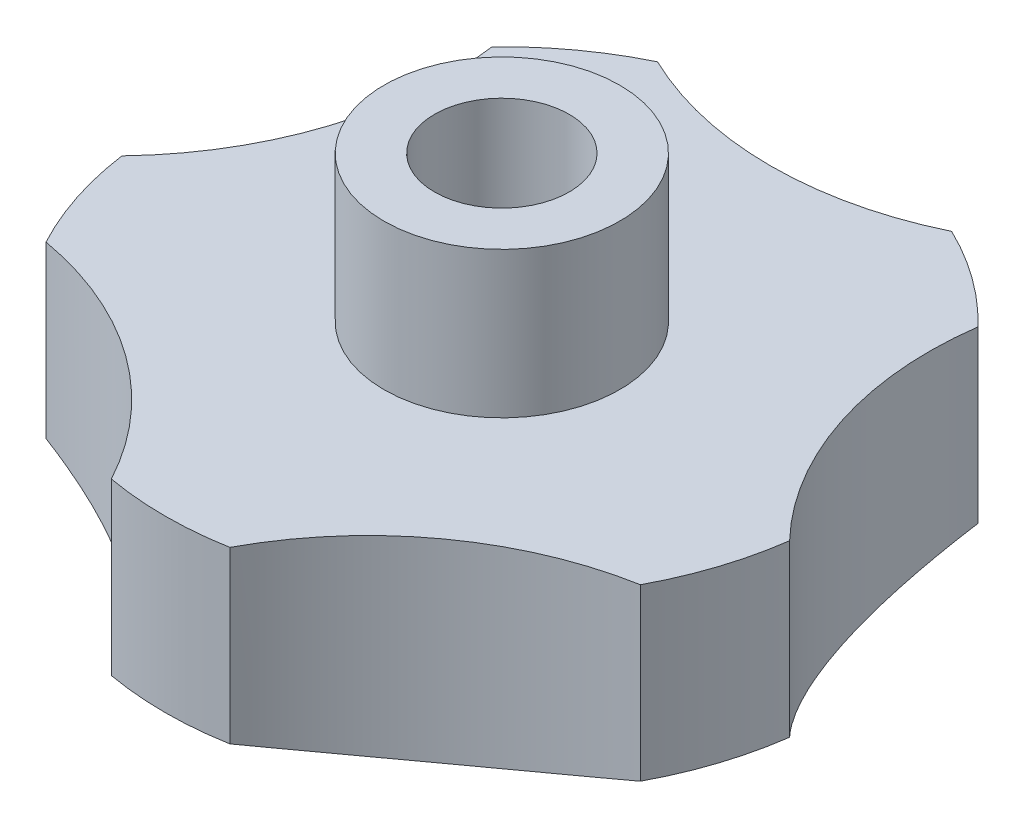
ISO-10303-21;
HEADER;
FILE_DESCRIPTION(('STEP AP214'),'2;1');
FILE_NAME('part.step','',(''),(''),'','','');
FILE_SCHEMA(('AUTOMOTIVE_DESIGN { 1 0 10303 214 1 1 1 1 }'));
ENDSEC;
DATA;
#1=APPLICATION_CONTEXT('core data for automotive mechanical design processes');
#2=APPLICATION_PROTOCOL_DEFINITION('international standard','automotive_design',2000,#1);
#3=PRODUCT_CONTEXT('',#1,'mechanical');
#4=PRODUCT('Part','Part','',(#3));
#5=PRODUCT_RELATED_PRODUCT_CATEGORY('part','',(#4));
#6=PRODUCT_DEFINITION_FORMATION('','',#4);
#7=PRODUCT_DEFINITION_CONTEXT('part definition',#1,'design');
#8=PRODUCT_DEFINITION('design','',#6,#7);
#9=PRODUCT_DEFINITION_SHAPE('','',#8);
#10=(LENGTH_UNIT() NAMED_UNIT(*) SI_UNIT(.MILLI.,.METRE.));
#11=(NAMED_UNIT(*) PLANE_ANGLE_UNIT() SI_UNIT($,.RADIAN.));
#12=(NAMED_UNIT(*) SI_UNIT($,.STERADIAN.) SOLID_ANGLE_UNIT());
#13=UNCERTAINTY_MEASURE_WITH_UNIT(LENGTH_MEASURE(1.E-05),#10,'distance_accuracy_value','');
#14=(GEOMETRIC_REPRESENTATION_CONTEXT(3) GLOBAL_UNCERTAINTY_ASSIGNED_CONTEXT((#13)) GLOBAL_UNIT_ASSIGNED_CONTEXT((#10,
#11,#12)) REPRESENTATION_CONTEXT('',''));
#15=CARTESIAN_POINT('',(0.,0.,0.));
#16=DIRECTION('',(0.,0.,1.));
#17=DIRECTION('',(1.,0.,0.));
#18=AXIS2_PLACEMENT_3D('',#15,#16,#17);
#19=CARTESIAN_POINT('',(55.5,-13.,15.));
#20=DIRECTION('',(0.,-1.,0.));
#21=DIRECTION('',(0.,0.,-1.));
#22=AXIS2_PLACEMENT_3D('',#19,#20,#21);
#23=CYLINDRICAL_SURFACE('',#22,30.);
#24=CARTESIAN_POINT('',(55.5,-28.16198487095,15.));
#25=DIRECTION('',(0.,-1.,0.));
#26=DIRECTION('',(0.,0.,-1.));
#27=AXIS2_PLACEMENT_3D('',#24,#25,#26);
#28=CIRCLE('',#27,30.);
#29=CARTESIAN_POINT('',(85.2204509421926,-28.16198487095,19.0859265525364));
#30=VERTEX_POINT('',#29);
#31=CARTESIAN_POINT('',(81.9671536916719,-28.1619848709578,29.1240849424393));
#32=VERTEX_POINT('',#31);
#33=EDGE_CURVE('E134',#30,#32,#28,.T.);
#34=ORIENTED_EDGE('',*,*,#33,.F.);
#35=DIRECTION('',(0.,1.,0.));
#36=VECTOR('',#35,1.);
#37=CARTESIAN_POINT('',(85.2204509421919,-34.001,19.085926552534));
#38=LINE('',#37,#36);
#39=CARTESIAN_POINT('',(85.2204509421919,-13.,19.085926552534));
#40=VERTEX_POINT('',#39);
#41=EDGE_CURVE('E120',#30,#40,#38,.T.);
#42=ORIENTED_EDGE('',*,*,#41,.T.);
#43=CARTESIAN_POINT('',(55.5,-13.,15.));
#44=DIRECTION('',(0.,1.,0.));
#45=DIRECTION('',(0.,0.,1.));
#46=AXIS2_PLACEMENT_3D('',#43,#44,#45);
#47=CIRCLE('',#46,30.);
#48=CARTESIAN_POINT('',(81.9671536916745,-13.,29.1240849424407));
#49=VERTEX_POINT('',#48);
#50=EDGE_CURVE('E171',#49,#40,#47,.T.);
#51=ORIENTED_EDGE('',*,*,#50,.F.);
#52=DIRECTION('',(0.,1.,0.));
#53=VECTOR('',#52,1.);
#54=CARTESIAN_POINT('',(81.9671536916719,-34.001,29.1240849424393));
#55=LINE('',#54,#53);
#56=EDGE_CURVE('E68',#32,#49,#55,.T.);
#57=ORIENTED_EDGE('',*,*,#56,.F.);
#58=EDGE_LOOP('',(#34,#42,#51,#57));
#59=FACE_BOUND('',#58,.T.);
#60=ADVANCED_FACE('F43',(#59),#23,.T.);
#61=CARTESIAN_POINT('',(55.5,-28.16198487095,15.));
#62=DIRECTION('',(0.,-1.,0.));
#63=DIRECTION('',(0.,0.,-1.));
#64=AXIS2_PLACEMENT_3D('',#61,#62,#63);
#65=CIRCLE('',#64,30.);
#66=CARTESIAN_POINT('',(60.7981773487384,-28.16198487095,44.528449278303));
#67=VERTEX_POINT('',#66);
#68=CARTESIAN_POINT('',(50.245997262254,-28.1619848709566,44.5363412634632));
#69=VERTEX_POINT('',#68);
#70=EDGE_CURVE('E53',#67,#69,#65,.T.);
#71=ORIENTED_EDGE('',*,*,#70,.F.);
#72=DIRECTION('',(0.,1.,0.));
#73=VECTOR('',#72,1.);
#74=CARTESIAN_POINT('',(60.7981773487367,-34.001,44.5284492783033));
#75=LINE('',#74,#73);
#76=CARTESIAN_POINT('',(60.7981773487367,-13.,44.5284492783033));
#77=VERTEX_POINT('',#76);
#78=EDGE_CURVE('E253',#67,#77,#75,.T.);
#79=ORIENTED_EDGE('',*,*,#78,.T.);
#80=CARTESIAN_POINT('',(50.245997262254,-13.,44.5363412634632));
#81=VERTEX_POINT('',#80);
#82=EDGE_CURVE('E169',#81,#77,#47,.T.);
#83=ORIENTED_EDGE('',*,*,#82,.F.);
#84=DIRECTION('',(0.,1.,0.));
#85=VECTOR('',#84,1.);
#86=CARTESIAN_POINT('',(50.245997262254,-34.001,44.5363412634632));
#87=LINE('',#86,#85);
#88=EDGE_CURVE('E214',#69,#81,#87,.T.);
#89=ORIENTED_EDGE('',*,*,#88,.F.);
#90=EDGE_LOOP('',(#71,#79,#83,#89));
#91=FACE_BOUND('',#90,.T.);
#92=ADVANCED_FACE('F276',(#91),#23,.T.);
#93=CARTESIAN_POINT('',(55.5,-28.16198487095,15.));
#94=DIRECTION('',(0.,-1.,0.));
#95=DIRECTION('',(0.,0.,-1.));
#96=AXIS2_PLACEMENT_3D('',#93,#94,#95);
#97=CIRCLE('',#96,30.);
#98=CARTESIAN_POINT('',(29.0540027377509,-28.16198487095,29.1636587365381));
#99=VERTEX_POINT('',#98);
#100=CARTESIAN_POINT('',(25.785694039408,-28.161984870956,19.1303778617005));
#101=VERTEX_POINT('',#100);
#102=EDGE_CURVE('E152',#99,#101,#97,.T.);
#103=ORIENTED_EDGE('',*,*,#102,.F.);
#104=DIRECTION('',(0.,1.,0.));
#105=VECTOR('',#104,1.);
#106=CARTESIAN_POINT('',(29.0540027377508,-34.001,29.1636587365379));
#107=LINE('',#106,#105);
#108=CARTESIAN_POINT('',(29.0540027377508,-13.,29.1636587365378));
#109=VERTEX_POINT('',#108);
#110=EDGE_CURVE('E262',#99,#109,#107,.T.);
#111=ORIENTED_EDGE('',*,*,#110,.T.);
#112=CARTESIAN_POINT('',(25.7856940394096,-13.,19.1303778617002));
#113=VERTEX_POINT('',#112);
#114=EDGE_CURVE('E161',#113,#109,#47,.T.);
#115=ORIENTED_EDGE('',*,*,#114,.F.);
#116=DIRECTION('',(0.,1.,0.));
#117=VECTOR('',#116,1.);
#118=CARTESIAN_POINT('',(25.785694039408,-34.001,19.1303778617005));
#119=LINE('',#118,#117);
#120=EDGE_CURVE('E190',#101,#113,#119,.T.);
#121=ORIENTED_EDGE('',*,*,#120,.F.);
#122=EDGE_LOOP('',(#103,#111,#115,#121));
#123=FACE_BOUND('',#122,.T.);
#124=ADVANCED_FACE('F266',(#123),#23,.T.);
#125=CARTESIAN_POINT('',(55.5,-28.16198487095,15.));
#126=DIRECTION('',(0.,-1.,0.));
#127=DIRECTION('',(0.,0.,-1.));
#128=AXIS2_PLACEMENT_3D('',#125,#126,#127);
#129=CIRCLE('',#128,30.);
#130=CARTESIAN_POINT('',(33.8572974768068,-28.16198487095,-5.77482677406887));
#131=VERTEX_POINT('',#130);
#132=CARTESIAN_POINT('',(42.3895517019842,-28.1619848709564,-11.98362735855));
#133=VERTEX_POINT('',#132);
#134=EDGE_CURVE('E147',#131,#133,#129,.T.);
#135=ORIENTED_EDGE('',*,*,#134,.F.);
#136=DIRECTION('',(0.,1.,0.));
#137=VECTOR('',#136,1.);
#138=CARTESIAN_POINT('',(33.8572974768057,-34.001,-5.77482677406999));
#139=LINE('',#138,#137);
#140=CARTESIAN_POINT('',(33.8572974768057,-13.,-5.77482677407));
#141=VERTEX_POINT('',#140);
#142=EDGE_CURVE('E218',#131,#141,#139,.T.);
#143=ORIENTED_EDGE('',*,*,#142,.T.);
#144=CARTESIAN_POINT('',(42.3895517019845,-13.,-11.9836273585495));
#145=VERTEX_POINT('',#144);
#146=EDGE_CURVE('E155',#145,#141,#47,.T.);
#147=ORIENTED_EDGE('',*,*,#146,.F.);
#148=DIRECTION('',(0.,1.,0.));
#149=VECTOR('',#148,1.);
#150=CARTESIAN_POINT('',(42.3895517019842,-34.001,-11.98362735855));
#151=LINE('',#150,#149);
#152=EDGE_CURVE('E172',#133,#145,#151,.T.);
#153=ORIENTED_EDGE('',*,*,#152,.F.);
#154=EDGE_LOOP('',(#135,#143,#147,#153));
#155=FACE_BOUND('',#154,.T.);
#156=ADVANCED_FACE('F222',(#155),#23,.T.);
#157=CARTESIAN_POINT('',(55.5,46.,15.));
#158=DIRECTION('',(1.,0.,0.));
#159=DIRECTION('',(0.,0.,1.));
#160=AXIS2_PLACEMENT_3D('',#157,#158,#159);
#161=SPHERICAL_SURFACE('',#160,80.);
#162=CARTESIAN_POINT('',(77.1116033046685,-28.1619848709569,-5.80717670904926));
#163=CARTESIAN_POINT('',(77.0499413857583,-28.3057619705109,-5.35878222840066));
#164=CARTESIAN_POINT('',(76.9981760830371,-28.4430570324421,-4.9069188916968));
#165=CARTESIAN_POINT('',(76.9150332863663,-28.7042542614438,-3.99727105366044));
#166=CARTESIAN_POINT('',(76.8836646979863,-28.8281505587187,-3.53948405480027));
#167=CARTESIAN_POINT('',(76.8419624041372,-29.0620084964046,-2.61934622458069));
#168=CARTESIAN_POINT('',(76.831631105385,-29.1719685411254,-2.15699487712792));
#169=CARTESIAN_POINT('',(76.8325042014414,-29.3775632483352,-1.22878108499693));
#170=CARTESIAN_POINT('',(76.8437241382562,-29.4731875187439,-0.762916347926156));
#171=CARTESIAN_POINT('',(76.8881148302794,-29.6495936119504,0.170515956728901));
#172=CARTESIAN_POINT('',(76.9212825978724,-29.7303774529673,0.638083283936881));
#173=CARTESIAN_POINT('',(77.0098232056805,-29.8767553460426,1.57347597268542));
#174=CARTESIAN_POINT('',(77.0651949786497,-29.9423501279312,2.04130132074498));
#175=CARTESIAN_POINT('',(77.1984432013172,-30.0582067279662,2.97693876286542));
#176=CARTESIAN_POINT('',(77.2763791325939,-30.1084272885915,3.4447475102946));
#177=CARTESIAN_POINT('',(77.4546798741421,-30.1930632047837,4.37755036241337));
#178=CARTESIAN_POINT('',(77.5550462869992,-30.2274774305019,4.84254426355198));
#179=CARTESIAN_POINT('',(77.7780300423941,-30.2803288316112,5.76809338772924));
#180=CARTESIAN_POINT('',(77.9006476822345,-30.2987657935081,6.22864855137452));
#181=CARTESIAN_POINT('',(78.1676954217505,-30.3195635454146,7.14336300180393));
#182=CARTESIAN_POINT('',(78.3121082246157,-30.3219370156651,7.59752705092104));
#183=CARTESIAN_POINT('',(78.6223384239734,-30.3106284422647,8.49828031449949));
#184=CARTESIAN_POINT('',(78.7881554697206,-30.2969466616771,8.94486965294989));
#185=CARTESIAN_POINT('',(79.1405399302335,-30.2536018263319,9.82892421771793));
#186=CARTESIAN_POINT('',(79.3271057917216,-30.223939967221,10.2663901241174));
#187=CARTESIAN_POINT('',(79.8090329663669,-30.1317967571654,11.3260104964225));
#188=CARTESIAN_POINT('',(80.11549477669,-30.0605451789217,11.9424129996385));
#189=CARTESIAN_POINT('',(80.7678605210495,-29.8853596491317,13.1491381364175));
#190=CARTESIAN_POINT('',(81.1137682442232,-29.7814225561572,13.7394582569618));
#191=CARTESIAN_POINT('',(81.8415895671283,-29.5419494862349,14.8901882926945));
#192=CARTESIAN_POINT('',(82.2234805205519,-29.4064333057336,15.4506166771836));
#193=CARTESIAN_POINT('',(83.0198397033724,-29.1050415603034,16.5388920339245));
#194=CARTESIAN_POINT('',(83.4342939285772,-28.9391790058296,17.0667528397363));
#195=CARTESIAN_POINT('',(84.0823744339332,-28.6667111960529,17.8381035041633));
#196=CARTESIAN_POINT('',(84.305353792303,-28.5707752433248,18.0944621524721));
#197=CARTESIAN_POINT('',(84.7579490086552,-28.3717360454929,18.5974134738965));
#198=CARTESIAN_POINT('',(84.9875511651928,-28.2686470533675,18.8440241134742));
#199=CARTESIAN_POINT('',(85.2204509421914,-28.1619848709572,19.0859265525344));
#200=B_SPLINE_CURVE_WITH_KNOTS('',3,(#162,#163,#164,#165,#166,#167,#168,#169,#170,#171,#172,
#173,#174,#175,#176,#177,#178,#179,#180,#181,#182,#183,#184,#185,#186,#187,#188,#189,#190,#191,
#192,#193,#194,#195,#196,#197,#198,#199),.UNSPECIFIED.,.F.,.F.,(4,2,2,2,2,2,2,2,2,2,2,2,2,2,2,2,
2,2,4),(0.,1.42458723845213,2.84979606019845,4.27516792012656,5.70156809491833,7.1277741430701,
8.55391164817268,9.98384338065177,11.4138773098156,12.8439303473252,14.2728543940491,
15.7017550283584,17.1305487656131,19.2041740379549,21.2779986688442,23.3505267316472,
25.4221683091345,26.4810810228227,27.5379412202216),.UNSPECIFIED.);
#201=CARTESIAN_POINT('',(77.1116033046679,-28.1619848709571,-5.80717670904934));
#202=VERTEX_POINT('',#201);
#203=EDGE_CURVE('E123',#202,#30,#200,.T.);
#204=ORIENTED_EDGE('',*,*,#203,.T.);
#205=ORIENTED_EDGE('',*,*,#33,.T.);
#206=CARTESIAN_POINT('',(81.967153691672,-28.1619848709578,29.1240849424394));
#207=CARTESIAN_POINT('',(81.5216506181313,-28.3057619705117,29.2040024873571));
#208=CARTESIAN_POINT('',(81.0759066890245,-28.4430570324428,29.2944042090627));
#209=CARTESIAN_POINT('',(80.1850876479952,-28.7042542614443,29.4964273513558));
#210=CARTESIAN_POINT('',(79.7400129127551,-28.8281505587192,29.6080580134219));
#211=CARTESIAN_POINT('',(78.8520231159314,-29.0620084964049,29.8527350018176));
#212=CARTESIAN_POINT('',(78.4091083072302,-29.1719685411256,29.9857837765527));
#213=CARTESIAN_POINT('',(77.5265943332282,-29.3775632483352,30.2734479764284));
#214=CARTESIAN_POINT('',(77.0869977904766,-29.4731875187438,30.4280788912835));
#215=CARTESIAN_POINT('',(76.2129683928413,-29.6495936119502,30.7587433934321));
#216=CARTESIAN_POINT('',(75.7785348433453,-29.730377452967,30.9347740650543));
#217=CARTESIAN_POINT('',(74.9162840839213,-29.8767553460421,31.3080334243046));
#218=CARTESIAN_POINT('',(74.4884665570174,-29.9423501279306,31.5052610927555));
#219=CARTESIAN_POINT('',(73.6397984360737,-30.0582067279654,31.9211155533972));
#220=CARTESIAN_POINT('',(73.2189694056883,-30.1084272885906,32.1397978817643));
#221=CARTESIAN_POINT('',(72.3869191340103,-30.1930632047826,32.5976238975803));
#222=CARTESIAN_POINT('',(71.9756985815322,-30.2274774305007,32.8367690462779));
#223=CARTESIAN_POINT('',(71.1643548257189,-30.2803288316098,33.3348496083739));
#224=CARTESIAN_POINT('',(70.7642317707416,-30.2987657935067,33.5937852861704));
#225=CARTESIAN_POINT('',(69.9768089219314,-30.319563545413,34.1304250891822));
#226=CARTESIAN_POINT('',(69.5894992538424,-30.3219370156633,34.4081142357949));
#227=CARTESIAN_POINT('',(68.828698396712,-30.3106284422627,34.9815087546302));
#228=CARTESIAN_POINT('',(68.4552069813638,-30.2969466616751,35.2772138315888));
#229=CARTESIAN_POINT('',(67.723313913633,-30.2536018263297,35.8855392534689));
#230=CARTESIAN_POINT('',(67.364911134465,-30.2239399672187,36.1981583312926));
#231=CARTESIAN_POINT('',(66.5060759616018,-30.1317967571629,36.983939013747));
#232=CARTESIAN_POINT('',(66.0145442517745,-30.060545178919,37.4658803643195));
#233=CARTESIAN_POINT('',(65.068472548619,-29.8853596491287,38.4592156313046));
#234=CARTESIAN_POINT('',(64.6139361162215,-29.7814225561541,38.9706123748355));
#235=CARTESIAN_POINT('',(63.7444359748879,-29.5419494862316,40.0184067236622));
#236=CARTESIAN_POINT('',(63.3294477025088,-29.4064333057301,40.5547884983671));
#237=CARTESIAN_POINT('',(62.5405248540753,-29.1050415602996,41.6484666682925));
#238=CARTESIAN_POINT('',(62.1665727939901,-28.9391790058257,42.2057540195399));
#239=CARTESIAN_POINT('',(61.6332426081176,-28.6667111960494,43.0604756711713));
#240=CARTESIAN_POINT('',(61.4583354562671,-28.5707752433218,43.3517608219288));
#241=CARTESIAN_POINT('',(61.1198599380748,-28.3717360454911,43.9376249573445));
#242=CARTESIAN_POINT('',(60.9562702506329,-28.2686470533663,44.2321964630964));
#243=CARTESIAN_POINT('',(60.7981773487366,-28.1619848709567,44.5284492783032));
#244=B_SPLINE_CURVE_WITH_KNOTS('',3,(#206,#207,#208,#209,#210,#211,#212,#213,#214,#215,#216,
#217,#218,#219,#220,#221,#222,#223,#224,#225,#226,#227,#228,#229,#230,#231,#232,#233,#234,#235,
#236,#237,#238,#239,#240,#241,#242,#243),.UNSPECIFIED.,.F.,.F.,(4,2,2,2,2,2,2,2,2,2,2,2,2,2,2,2,
2,2,4),(0.,1.42458723845203,2.84979606019823,4.27516792012624,5.70156809491791,7.12777414306956,
8.55391164817204,9.98384338065102,11.4138773098147,12.8439303473242,14.272854394048,
15.7017550283572,17.1305487656118,19.2041740379536,21.2779986688428,23.3505267316457,
25.422168309133,26.4810810228148,27.5379412202074),.UNSPECIFIED.);
#245=EDGE_CURVE('E226',#32,#67,#244,.T.);
#246=ORIENTED_EDGE('',*,*,#245,.T.);
#247=ORIENTED_EDGE('',*,*,#70,.T.);
#248=CARTESIAN_POINT('',(50.245997262254,-28.1619848709566,44.5363412634632));
#249=CARTESIAN_POINT('',(50.0323231396233,-28.3057619705106,44.1373385418711));
#250=CARTESIAN_POINT('',(49.8086035438775,-28.4430570324418,43.7413465418228));
#251=CARTESIAN_POINT('',(49.3411898953663,-28.7042542614434,42.9565558722375));
#252=CARTESIAN_POINT('',(49.097487169834,-28.8281505587183,42.5677604167208));
#253=CARTESIAN_POINT('',(48.5903815875827,-29.0620084964042,41.7988412815946));
#254=CARTESIAN_POINT('',(48.3269764804369,-29.171968541125,41.4187185990896));
#255=CARTESIAN_POINT('',(47.7806797529003,-29.3775632483347,40.6682910598283));
#256=CARTESIAN_POINT('',(47.4977742113279,-29.4731875187434,40.2979934838494));
#257=CARTESIAN_POINT('',(46.9132036443993,-29.6495936119498,39.5689230803952));
#258=CARTESIAN_POINT('',(46.6115411773644,-29.7303774529667,39.2101486913122));
#259=CARTESIAN_POINT('',(45.9901002934066,-29.8767553460419,38.5054429731993));
#260=CARTESIAN_POINT('',(45.6703227478278,-29.9423501279305,38.1595110277643));
#261=CARTESIAN_POINT('',(45.0125687812483,-30.0582067279654,37.4808857766936));
#262=CARTESIAN_POINT('',(44.6745462057407,-30.1084272885907,37.1482301409343));
#263=CARTESIAN_POINT('',(43.9820101159466,-30.1930632047828,36.4983793275238));
#264=CARTESIAN_POINT('',(43.6274954247855,-30.227477430501,36.1811852565248));
#265=CARTESIAN_POINT('',(42.9030736517378,-30.2803288316102,35.5634668488586));
#266=CARTESIAN_POINT('',(42.5331663642388,-30.2987657935071,35.2629427349915));
#267=CARTESIAN_POINT('',(41.7794645406396,-30.3195635454136,34.6798899225395));
#268=CARTESIAN_POINT('',(41.3956811987239,-30.3219370156639,34.397347204336));
#269=CARTESIAN_POINT('',(40.6152502109893,-30.3106284422635,33.8509712423607));
#270=CARTESIAN_POINT('',(40.2186027760505,-30.2969466616759,33.5871376921166));
#271=CARTESIAN_POINT('',(39.4138835235493,-30.2536018263305,33.0790489142911));
#272=CARTESIAN_POINT('',(39.0058125628728,-30.2239399672197,32.8347922235184));
#273=CARTESIAN_POINT('',(37.9930960606639,-30.131796757164,32.2608110206732));
#274=CARTESIAN_POINT('',(37.3828509471191,-30.0605451789202,31.942264652695));
#275=CARTESIAN_POINT('',(36.1457807344147,-29.88535964913,31.3494544731368));
#276=CARTESIAN_POINT('',(35.5189540468941,-29.7814225561555,31.0751949218307));
#277=CARTESIAN_POINT('',(34.2537520834217,-29.541949486233,30.5720374068931));
#278=CARTESIAN_POINT('',(33.615384272735,-29.4064333057316,30.3431111901176));
#279=CARTESIAN_POINT('',(32.331443955081,-29.1050415603013,29.9307661151446));
#280=CARTESIAN_POINT('',(31.6858746465804,-28.9391790058274,29.7473278339041));
#281=CARTESIAN_POINT('',(30.708177959129,-28.666711196051,29.5042242011071));
#282=CARTESIAN_POINT('',(30.3771000360404,-28.5707752433231,29.427889676386));
#283=CARTESIAN_POINT('',(29.7153154450863,-28.3717360454917,29.2870223034406));
#284=CARTESIAN_POINT('',(29.384609301501,-28.2686470533666,29.2224668665361));
#285=CARTESIAN_POINT('',(29.0540027377507,-28.1619848709566,29.1636587365379));
#286=B_SPLINE_CURVE_WITH_KNOTS('',3,(#248,#249,#250,#251,#252,#253,#254,#255,#256,#257,#258,
#259,#260,#261,#262,#263,#264,#265,#266,#267,#268,#269,#270,#271,#272,#273,#274,#275,#276,#277,
#278,#279,#280,#281,#282,#283,#284,#285),.UNSPECIFIED.,.F.,.F.,(4,2,2,2,2,2,2,2,2,2,2,2,2,2,2,2,
2,2,4),(0.,1.42458723845219,2.84979606019855,4.27516792012671,5.70156809491852,7.12777414307033,
8.55391164817296,9.9838433806521,11.413877309816,12.8439303473256,14.2728543940495,
15.7017550283589,17.1305487656137,19.2041740379556,21.277998668845,23.350526731648,
25.4221683091354,26.4810810228206,27.5379412202165),.UNSPECIFIED.);
#287=EDGE_CURVE('E255',#69,#99,#286,.T.);
#288=ORIENTED_EDGE('',*,*,#287,.T.);
#289=ORIENTED_EDGE('',*,*,#102,.T.);
#290=CARTESIAN_POINT('',(25.785694039408,-28.161984870956,19.1303778617005));
#291=CARTESIAN_POINT('',(26.0991392426467,-28.30576197051,18.8038630732352));
#292=CARTESIAN_POINT('',(26.4066168576332,-28.4430570324411,18.4687248362268));
#293=CARTESIAN_POINT('',(27.0085583770772,-28.7042542614428,17.7816743860763));
#294=CARTESIAN_POINT('',(27.3030165447874,-28.8281505587177,17.4297549178295));
#295=CARTESIAN_POINT('',(27.8775978558951,-29.0620084964036,16.7098597693258));
#296=CARTESIAN_POINT('',(28.1577193555699,-29.1719685411243,16.3418822569079));
#297=CARTESIAN_POINT('',(28.7026033840115,-29.377563248334,15.5904283316749));
#298=CARTESIAN_POINT('',(28.9673546864658,-29.4731875187427,15.2069409289132));
#299=CARTESIAN_POINT('',(29.4800996049165,-29.6495936119492,14.4256861372384));
#300=CARTESIAN_POINT('',(29.7280954966549,-29.7303774529661,14.02792069887));
#301=CARTESIAN_POINT('',(30.2062746677943,-29.8767553460413,13.2191292537596));
#302=CARTESIAN_POINT('',(30.4364588026915,-29.9423501279299,12.8081038852355));
#303=CARTESIAN_POINT('',(30.8786126160542,-30.0582067279648,11.9728359538084));
#304=CARTESIAN_POINT('',(31.0905322058112,-30.1084272885901,11.5485611359928));
#305=CARTESIAN_POINT('',(31.4945716355607,-30.1930632047823,10.6891052298724));
#306=CARTESIAN_POINT('',(31.68669005939,-30.2274774305005,10.2539233642676));
#307=CARTESIAN_POINT('',(32.0503165372696,-30.2803288316097,9.37407183075749));
#308=CARTESIAN_POINT('',(32.2218243158864,-30.2987657935066,8.92940203615222));
#309=CARTESIAN_POINT('',(32.5434338203296,-30.3195635454131,8.03241577780889));
#310=CARTESIAN_POINT('',(32.6935523387988,-30.3219370156635,7.58010562807267));
#311=CARTESIAN_POINT('',(32.9720203196357,-30.310628442263,6.66903219410076));
#312=CARTESIAN_POINT('',(33.1003701386414,-30.2969466616754,6.21026901571883));
#313=CARTESIAN_POINT('',(33.3349193569251,-30.2536018263301,5.2879274598402));
#314=CARTESIAN_POINT('',(33.4411204125733,-30.2239399672192,4.82434944513945));
#315=CARTESIAN_POINT('',(33.6740623661037,-30.1317967571636,3.68382887042318));
#316=CARTESIAN_POINT('',(33.788441854292,-30.0605451789198,3.00501503744744));
#317=CARTESIAN_POINT('',(33.9699621195263,-29.8853596491297,1.64530293061848));
#318=CARTESIAN_POINT('',(34.0370983539806,-29.7814225561551,0.964404462641115));
#319=CARTESIAN_POINT('',(34.1246606792554,-29.5419494862327,-0.394358332111908));
#320=CARTESIAN_POINT('',(34.1451159473065,-29.4064333057314,-1.07222428970004));
#321=CARTESIAN_POINT('',(34.1405200399036,-29.1050415603011,-2.42074573105238));
#322=CARTESIAN_POINT('',(34.1154883252418,-28.9391790058272,-3.09140417494422));
#323=CARTESIAN_POINT('',(34.0445687275819,-28.6667111960507,-4.09637213443387));
#324=CARTESIAN_POINT('',(34.0148584700395,-28.5707752433227,-4.43483461598533));
#325=CARTESIAN_POINT('',(33.9443286177922,-28.3717360454913,-5.10775957578955));
#326=CARTESIAN_POINT('',(33.9035306682105,-28.2686470533661,-5.44222853570825));
#327=CARTESIAN_POINT('',(33.8572974768057,-28.161984870956,-5.77482677406999));
#328=B_SPLINE_CURVE_WITH_KNOTS('',3,(#290,#291,#292,#293,#294,#295,#296,#297,#298,#299,#300,
#301,#302,#303,#304,#305,#306,#307,#308,#309,#310,#311,#312,#313,#314,#315,#316,#317,#318,#319,
#320,#321,#322,#323,#324,#325,#326,#327),.UNSPECIFIED.,.F.,.F.,(4,2,2,2,2,2,2,2,2,2,2,2,2,2,2,2,
2,2,4),(0.,1.42458723845211,2.8497960601984,4.27516792012648,5.70156809491822,7.12777414306997,
8.55391164817252,9.98384338065159,11.4138773098154,12.843930347325,14.2728543940488,
15.7017550283581,17.1305487656128,19.2041740379546,21.2779986688439,23.3505267316468,
25.4221683091341,26.4810810228201,27.5379412202168),.UNSPECIFIED.);
#329=EDGE_CURVE('E208',#101,#131,#328,.T.);
#330=ORIENTED_EDGE('',*,*,#329,.T.);
#331=ORIENTED_EDGE('',*,*,#134,.T.);
#332=CARTESIAN_POINT('',(42.3895517019842,-28.1619848709564,-11.98362735855));
#333=CARTESIAN_POINT('',(42.7969456138268,-28.3057619705104,-11.7864218740589));
#334=CARTESIAN_POINT('',(43.2106968264141,-28.4430570324416,-11.5975566954114));
#335=CARTESIAN_POINT('',(44.0501307931812,-28.7042542614433,-11.237386556005));
#336=CARTESIAN_POINT('',(44.4758186746234,-28.8281505587183,-11.0660892931675));
#337=CARTESIAN_POINT('',(45.3380350364396,-29.0620084964043,-10.7420898281527));
#338=CARTESIAN_POINT('',(45.774564751364,-29.171968541125,-10.5893897554175));
#339=CARTESIAN_POINT('',(46.6576183284044,-29.3775632483348,-10.3033862829296));
#340=CARTESIAN_POINT('',(47.1041491734592,-29.4731875187436,-10.1700969561148));
#341=CARTESIAN_POINT('',(48.005613527549,-29.6495936119501,-9.92386856778924));
#342=CARTESIAN_POINT('',(48.4605458847486,-29.7303774529671,-9.81092673916781));
#343=CARTESIAN_POINT('',(49.3775177491828,-29.8767553460424,-9.60608162394306));
#344=CARTESIAN_POINT('',(49.839556913799,-29.942350127931,-9.51417732649439));
#345=CARTESIAN_POINT('',(50.7705769652919,-30.058206727966,-9.35177604675836));
#346=CARTESIAN_POINT('',(51.2395730501513,-30.1084272885914,-9.28133666897965));
#347=CARTESIAN_POINT('',(52.1818192403256,-30.1930632047836,-9.1626588173832));
#348=CARTESIAN_POINT('',(52.6550696472783,-30.2274774305019,-9.11442193061554));
#349=CARTESIAN_POINT('',(53.6042249428649,-30.2803288316112,-9.04048167571212));
#350=CARTESIAN_POINT('',(54.0801298668839,-30.2987657935081,-9.01477860868151));
#351=CARTESIAN_POINT('',(55.0325972953341,-30.3195635454147,-8.98609379132709));
#352=CARTESIAN_POINT('',(55.5091589840045,-30.3219370156651,-8.98309411911707));
#353=CARTESIAN_POINT('',(56.4616926486748,-30.3106284422648,-8.99979250558333));
#354=CARTESIAN_POINT('',(56.937664634209,-30.2969466616772,-9.01949019236612));
#355=CARTESIAN_POINT('',(57.8873432756442,-30.253601826332,-9.08143984531001));
#356=CARTESIAN_POINT('',(58.3610500983524,-30.2239399672212,-9.12369012405947));
#357=CARTESIAN_POINT('',(59.5177326452489,-30.1317967571656,-9.25458940125735));
#358=CARTESIAN_POINT('',(60.1986681701098,-30.0605451789219,-9.35557305409165));
#359=CARTESIAN_POINT('',(61.5479240763758,-29.8853596491319,-9.60311117146827));
#360=CARTESIAN_POINT('',(62.2162432386659,-29.7814225561575,-9.74967001625975));
#361=CARTESIAN_POINT('',(63.5355616952921,-29.5419494862353,-10.0862740911281));
#362=CARTESIAN_POINT('',(64.1865715568833,-29.4064333057339,-10.2762920759586));
#363=CARTESIAN_POINT('',(65.4676714475532,-29.1050415603038,-10.6973790862991));
#364=CARTESIAN_POINT('',(66.0977703055961,-28.93917900583,-10.9284305182258));
#365=CARTESIAN_POINT('',(67.0316362712268,-28.6667111960532,-11.3064312419984));
#366=CARTESIAN_POINT('',(67.3443522453412,-28.5707752433249,-11.4392780347932));
#367=CARTESIAN_POINT('',(67.9625469903881,-28.3717360454926,-11.714301158886));
#368=CARTESIAN_POINT('',(68.2680386144621,-28.2686470533669,-11.8564589073937));
#369=CARTESIAN_POINT('',(68.5700714945173,-28.1619848709564,-12.0032077933019));
#370=B_SPLINE_CURVE_WITH_KNOTS('',3,(#332,#333,#334,#335,#336,#337,#338,#339,#340,#341,#342,
#343,#344,#345,#346,#347,#348,#349,#350,#351,#352,#353,#354,#355,#356,#357,#358,#359,#360,#361,
#362,#363,#364,#365,#366,#367,#368,#369),.UNSPECIFIED.,.F.,.F.,(4,2,2,2,2,2,2,2,2,2,2,2,2,2,2,2,
2,2,4),(0.,1.42458723845216,2.84979606019851,4.27516792012664,5.70156809491842,7.12777414307022,
8.55391164817283,9.98384338065196,11.4138773098158,12.8439303473255,14.2728543940493,
15.7017550283587,17.1305487656134,19.2041740379552,21.2779986688445,23.3505267316475,
25.4221683091348,26.4810810228252,27.5379412202264),.UNSPECIFIED.);
#371=CARTESIAN_POINT('',(68.5700714945177,-28.16198487095,-12.0032077933011));
#372=VERTEX_POINT('',#371);
#373=EDGE_CURVE('E183',#133,#372,#370,.T.);
#374=ORIENTED_EDGE('',*,*,#373,.T.);
#375=CARTESIAN_POINT('',(55.5,-28.16198487095,15.));
#376=DIRECTION('',(0.,-1.,0.));
#377=DIRECTION('',(0.,0.,-1.));
#378=AXIS2_PLACEMENT_3D('',#375,#376,#377);
#379=CIRCLE('',#378,30.);
#380=EDGE_CURVE('E137',#372,#202,#379,.T.);
#381=ORIENTED_EDGE('',*,*,#380,.T.);
#382=EDGE_LOOP('',(#204,#205,#246,#247,#288,#289,#330,#331,#374,#381));
#383=FACE_BOUND('',#382,.T.);
#384=ADVANCED_FACE('F45',(#383),#161,.T.);
#385=CARTESIAN_POINT('',(77.1116033046686,-13.,-5.80717670905008));
#386=VERTEX_POINT('',#385);
#387=CARTESIAN_POINT('',(68.5700714945173,-13.,-12.0032077933019));
#388=VERTEX_POINT('',#387);
#389=EDGE_CURVE('E163',#386,#388,#47,.T.);
#390=ORIENTED_EDGE('',*,*,#389,.F.);
#391=DIRECTION('',(0.,1.,0.));
#392=VECTOR('',#391,1.);
#393=CARTESIAN_POINT('',(77.1116033046679,-34.001,-5.80717670904934));
#394=LINE('',#393,#392);
#395=EDGE_CURVE('E60',#202,#386,#394,.T.);
#396=ORIENTED_EDGE('',*,*,#395,.F.);
#397=ORIENTED_EDGE('',*,*,#380,.F.);
#398=DIRECTION('',(0.,1.,0.));
#399=VECTOR('',#398,1.);
#400=CARTESIAN_POINT('',(68.5700714945173,-34.001,-12.0032077933019));
#401=LINE('',#400,#399);
#402=EDGE_CURVE('E175',#372,#388,#401,.T.);
#403=ORIENTED_EDGE('',*,*,#402,.T.);
#404=EDGE_LOOP('',(#390,#396,#397,#403));
#405=FACE_BOUND('',#404,.T.);
#406=ADVANCED_FACE('F225',(#405),#23,.T.);
#407=CARTESIAN_POINT('',(55.5,-13.,15.));
#408=DIRECTION('',(0.,1.,0.));
#409=DIRECTION('',(0.,0.,1.));
#410=AXIS2_PLACEMENT_3D('',#407,#408,#409);
#411=PLANE('',#410);
#412=CARTESIAN_POINT('',(55.5,-13.,15.));
#413=DIRECTION('',(0.,1.,0.));
#414=DIRECTION('',(0.,0.,1.));
#415=AXIS2_PLACEMENT_3D('',#412,#413,#414);
#416=CIRCLE('',#415,10.5);
#417=CARTESIAN_POINT('',(55.5,-13.,25.5));
#418=VERTEX_POINT('',#417);
#419=EDGE_CURVE('E13',#418,#418,#416,.T.);
#420=ORIENTED_EDGE('',*,*,#419,.F.);
#421=EDGE_LOOP('',(#420));
#422=FACE_BOUND('',#421,.T.);
#423=CARTESIAN_POINT('',(106.83205424686,-13.,-1.721250156514));
#424=DIRECTION('',(0.,1.,0.));
#425=DIRECTION('',(0.,0.,1.));
#426=AXIS2_PLACEMENT_3D('',#423,#424,#425);
#427=CIRCLE('',#426,29.9999999999988);
#428=EDGE_CURVE('E124',#386,#40,#427,.T.);
#429=ORIENTED_EDGE('',*,*,#428,.F.);
#430=ORIENTED_EDGE('',*,*,#389,.T.);
#431=CARTESIAN_POINT('',(55.4596231965015,-13.,-38.98683515185));
#432=DIRECTION('',(0.,1.,0.));
#433=DIRECTION('',(0.,0.,1.));
#434=AXIS2_PLACEMENT_3D('',#431,#432,#433);
#435=CIRCLE('',#434,29.9999999999988);
#436=EDGE_CURVE('E180',#145,#388,#435,.T.);
#437=ORIENTED_EDGE('',*,*,#436,.F.);
#438=ORIENTED_EDGE('',*,*,#146,.T.);
#439=CARTESIAN_POINT('',(4.14299151621534,-13.,-1.64444891236898));
#440=DIRECTION('',(0.,1.,0.));
#441=DIRECTION('',(0.,0.,1.));
#442=AXIS2_PLACEMENT_3D('',#439,#440,#441);
#443=CIRCLE('',#442,30.0000000000001);
#444=EDGE_CURVE('E213',#113,#141,#443,.T.);
#445=ORIENTED_EDGE('',*,*,#444,.F.);
#446=ORIENTED_EDGE('',*,*,#114,.T.);
#447=CARTESIAN_POINT('',(23.8000000000036,-13.,58.7000000000026));
#448=DIRECTION('',(0.,1.,0.));
#449=DIRECTION('',(0.,0.,1.));
#450=AXIS2_PLACEMENT_3D('',#447,#448,#449);
#451=CIRCLE('',#450,30.0000000000017);
#452=EDGE_CURVE('E260',#81,#109,#451,.T.);
#453=ORIENTED_EDGE('',*,*,#452,.F.);
#454=ORIENTED_EDGE('',*,*,#82,.T.);
#455=CARTESIAN_POINT('',(87.265331040412,-13.,58.652534220742));
#456=DIRECTION('',(0.,1.,0.));
#457=DIRECTION('',(0.,0.,1.));
#458=AXIS2_PLACEMENT_3D('',#455,#456,#457);
#459=CIRCLE('',#458,29.9999999999999);
#460=EDGE_CURVE('E228',#49,#77,#459,.T.);
#461=ORIENTED_EDGE('',*,*,#460,.F.);
#462=ORIENTED_EDGE('',*,*,#50,.T.);
#463=EDGE_LOOP('',(#429,#430,#437,#438,#445,#446,#453,#454,#461,#462));
#464=FACE_BOUND('',#463,.T.);
#465=ADVANCED_FACE('F269',(#422,#464),#411,.T.);
#466=CARTESIAN_POINT('',(55.4596231965015,-34.001,-38.98683515185));
#467=DIRECTION('',(0.,1.,0.));
#468=DIRECTION('',(0.,0.,1.));
#469=AXIS2_PLACEMENT_3D('',#466,#467,#468);
#470=CYLINDRICAL_SURFACE('',#469,29.9999999999988);
#471=ORIENTED_EDGE('',*,*,#152,.T.);
#472=ORIENTED_EDGE('',*,*,#436,.T.);
#473=ORIENTED_EDGE('',*,*,#402,.F.);
#474=ORIENTED_EDGE('',*,*,#373,.F.);
#475=EDGE_LOOP('',(#471,#472,#473,#474));
#476=FACE_BOUND('',#475,.T.);
#477=ADVANCED_FACE('F193',(#476),#470,.F.);
#478=CARTESIAN_POINT('',(4.14299151621534,-34.001,-1.64444891236897));
#479=DIRECTION('',(0.,1.,0.));
#480=DIRECTION('',(0.,0.,1.));
#481=AXIS2_PLACEMENT_3D('',#478,#479,#480);
#482=CYLINDRICAL_SURFACE('',#481,30.0000000000001);
#483=ORIENTED_EDGE('',*,*,#120,.T.);
#484=ORIENTED_EDGE('',*,*,#444,.T.);
#485=ORIENTED_EDGE('',*,*,#142,.F.);
#486=ORIENTED_EDGE('',*,*,#329,.F.);
#487=EDGE_LOOP('',(#483,#484,#485,#486));
#488=FACE_BOUND('',#487,.T.);
#489=ADVANCED_FACE('F198',(#488),#482,.F.);
#490=CARTESIAN_POINT('',(23.8000000000036,-34.001,58.7000000000026));
#491=DIRECTION('',(0.,1.,0.));
#492=DIRECTION('',(0.,0.,1.));
#493=AXIS2_PLACEMENT_3D('',#490,#491,#492);
#494=CYLINDRICAL_SURFACE('',#493,30.0000000000017);
#495=ORIENTED_EDGE('',*,*,#88,.T.);
#496=ORIENTED_EDGE('',*,*,#452,.T.);
#497=ORIENTED_EDGE('',*,*,#110,.F.);
#498=ORIENTED_EDGE('',*,*,#287,.F.);
#499=EDGE_LOOP('',(#495,#496,#497,#498));
#500=FACE_BOUND('',#499,.T.);
#501=ADVANCED_FACE('F202',(#500),#494,.F.);
#502=CARTESIAN_POINT('',(87.265331040412,-34.001,58.652534220742));
#503=DIRECTION('',(0.,1.,0.));
#504=DIRECTION('',(0.,0.,1.));
#505=AXIS2_PLACEMENT_3D('',#502,#503,#504);
#506=CYLINDRICAL_SURFACE('',#505,29.9999999999999);
#507=ORIENTED_EDGE('',*,*,#56,.T.);
#508=ORIENTED_EDGE('',*,*,#460,.T.);
#509=ORIENTED_EDGE('',*,*,#78,.F.);
#510=ORIENTED_EDGE('',*,*,#245,.F.);
#511=EDGE_LOOP('',(#507,#508,#509,#510));
#512=FACE_BOUND('',#511,.T.);
#513=ADVANCED_FACE('F243',(#512),#506,.F.);
#514=CARTESIAN_POINT('',(106.83205424686,-34.001,-1.721250156514));
#515=DIRECTION('',(0.,1.,0.));
#516=DIRECTION('',(0.,0.,1.));
#517=AXIS2_PLACEMENT_3D('',#514,#515,#516);
#518=CYLINDRICAL_SURFACE('',#517,29.9999999999988);
#519=ORIENTED_EDGE('',*,*,#395,.T.);
#520=ORIENTED_EDGE('',*,*,#428,.T.);
#521=ORIENTED_EDGE('',*,*,#41,.F.);
#522=ORIENTED_EDGE('',*,*,#203,.F.);
#523=EDGE_LOOP('',(#519,#520,#521,#522));
#524=FACE_BOUND('',#523,.T.);
#525=ADVANCED_FACE('F122',(#524),#518,.F.);
#526=CARTESIAN_POINT('',(55.5,0.,15.));
#527=DIRECTION('',(0.,-1.,0.));
#528=DIRECTION('',(0.,0.,-1.));
#529=AXIS2_PLACEMENT_3D('',#526,#527,#528);
#530=CYLINDRICAL_SURFACE('',#529,10.5);
#531=CARTESIAN_POINT('',(55.5,0.,15.));
#532=DIRECTION('',(0.,-1.,0.));
#533=DIRECTION('',(0.,0.,-1.));
#534=AXIS2_PLACEMENT_3D('',#531,#532,#533);
#535=CIRCLE('',#534,10.5);
#536=CARTESIAN_POINT('',(55.5,0.,4.5));
#537=VERTEX_POINT('',#536);
#538=EDGE_CURVE('E138',#537,#537,#535,.T.);
#539=ORIENTED_EDGE('',*,*,#538,.T.);
#540=EDGE_LOOP('',(#539));
#541=FACE_BOUND('',#540,.T.);
#542=ORIENTED_EDGE('',*,*,#419,.T.);
#543=EDGE_LOOP('',(#542));
#544=FACE_BOUND('',#543,.T.);
#545=ADVANCED_FACE('F334',(#541,#544),#530,.T.);
#546=CARTESIAN_POINT('',(66.,0.,15.));
#547=DIRECTION('',(0.,1.,0.));
#548=DIRECTION('',(0.,0.,1.));
#549=AXIS2_PLACEMENT_3D('',#546,#547,#548);
#550=PLANE('',#549);
#551=CARTESIAN_POINT('',(55.5,0.,15.));
#552=DIRECTION('',(0.,1.,0.));
#553=DIRECTION('',(0.,0.,1.));
#554=AXIS2_PLACEMENT_3D('',#551,#552,#553);
#555=CIRCLE('',#554,5.99999999999998);
#556=CARTESIAN_POINT('',(55.5,0.,21.));
#557=VERTEX_POINT('',#556);
#558=EDGE_CURVE('E397',#557,#557,#555,.T.);
#559=ORIENTED_EDGE('',*,*,#558,.F.);
#560=EDGE_LOOP('',(#559));
#561=FACE_BOUND('',#560,.T.);
#562=ORIENTED_EDGE('',*,*,#538,.F.);
#563=EDGE_LOOP('',(#562));
#564=FACE_BOUND('',#563,.T.);
#565=ADVANCED_FACE('F349',(#561,#564),#550,.T.);
#566=CARTESIAN_POINT('',(55.5,-18.,15.));
#567=DIRECTION('',(0.,-1.,0.));
#568=DIRECTION('',(0.,0.,-1.));
#569=AXIS2_PLACEMENT_3D('',#566,#567,#568);
#570=PLANE('',#569);
#571=CARTESIAN_POINT('',(55.5,-18.,15.));
#572=DIRECTION('',(0.,1.,0.));
#573=DIRECTION('',(0.,0.,1.));
#574=AXIS2_PLACEMENT_3D('',#571,#572,#573);
#575=CIRCLE('',#574,5.99999999999998);
#576=CARTESIAN_POINT('',(55.5,-18.,21.));
#577=VERTEX_POINT('',#576);
#578=EDGE_CURVE('E394',#577,#577,#575,.T.);
#579=ORIENTED_EDGE('',*,*,#578,.T.);
#580=EDGE_LOOP('',(#579));
#581=FACE_BOUND('',#580,.T.);
#582=ADVANCED_FACE('F359',(#581),#570,.F.);
#583=CARTESIAN_POINT('',(55.5,0.,15.));
#584=DIRECTION('',(0.,1.,0.));
#585=DIRECTION('',(0.,0.,1.));
#586=AXIS2_PLACEMENT_3D('',#583,#584,#585);
#587=CYLINDRICAL_SURFACE('',#586,5.99999999999998);
#588=ORIENTED_EDGE('',*,*,#578,.F.);
#589=EDGE_LOOP('',(#588));
#590=FACE_BOUND('',#589,.T.);
#591=ORIENTED_EDGE('',*,*,#558,.T.);
#592=EDGE_LOOP('',(#591));
#593=FACE_BOUND('',#592,.T.);
#594=ADVANCED_FACE('F369',(#590,#593),#587,.F.);
#595=CLOSED_SHELL('',(#60,#92,#124,#156,#384,#406,#465,#477,#489,#501,#513,#525,#545,#565,#582,#594));
#596=MANIFOLD_SOLID_BREP('B2',#595);
#597=ADVANCED_BREP_SHAPE_REPRESENTATION('',(#18,#596),#14);
#598=SHAPE_DEFINITION_REPRESENTATION(#9,#597);
ENDSEC;
END-ISO-10303-21;
